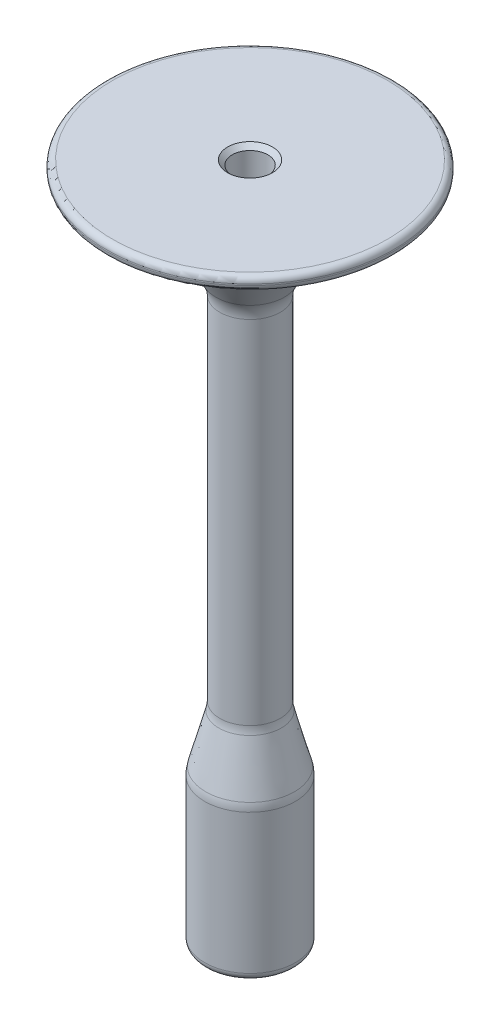
ISO-10303-21;
HEADER;
FILE_DESCRIPTION(('STEP AP214'),'2;1');
FILE_NAME('part.step','',(''),(''),'','','');
FILE_SCHEMA(('AUTOMOTIVE_DESIGN { 1 0 10303 214 1 1 1 1 }'));
ENDSEC;
DATA;
#1=APPLICATION_CONTEXT('core data for automotive mechanical design processes');
#2=APPLICATION_PROTOCOL_DEFINITION('international standard','automotive_design',2000,#1);
#3=PRODUCT_CONTEXT('',#1,'mechanical');
#4=PRODUCT('Part','Part','',(#3));
#5=PRODUCT_RELATED_PRODUCT_CATEGORY('part','',(#4));
#6=PRODUCT_DEFINITION_FORMATION('','',#4);
#7=PRODUCT_DEFINITION_CONTEXT('part definition',#1,'design');
#8=PRODUCT_DEFINITION('design','',#6,#7);
#9=PRODUCT_DEFINITION_SHAPE('','',#8);
#10=(LENGTH_UNIT() NAMED_UNIT(*) SI_UNIT(.MILLI.,.METRE.));
#11=(NAMED_UNIT(*) PLANE_ANGLE_UNIT() SI_UNIT($,.RADIAN.));
#12=(NAMED_UNIT(*) SI_UNIT($,.STERADIAN.) SOLID_ANGLE_UNIT());
#13=UNCERTAINTY_MEASURE_WITH_UNIT(LENGTH_MEASURE(1.E-05),#10,'distance_accuracy_value','');
#14=(GEOMETRIC_REPRESENTATION_CONTEXT(3) GLOBAL_UNCERTAINTY_ASSIGNED_CONTEXT((#13)) GLOBAL_UNIT_ASSIGNED_CONTEXT((#10,
#11,#12)) REPRESENTATION_CONTEXT('',''));
#15=CARTESIAN_POINT('',(0.,0.,0.));
#16=DIRECTION('',(0.,0.,1.));
#17=DIRECTION('',(1.,0.,0.));
#18=AXIS2_PLACEMENT_3D('',#15,#16,#17);
#19=CARTESIAN_POINT('',(0.,109.204446453007,0.));
#20=DIRECTION('',(0.,1.,0.));
#21=DIRECTION('',(0.,0.,1.));
#22=AXIS2_PLACEMENT_3D('',#19,#20,#21);
#23=CONICAL_SURFACE('',#22,12.696662510913,0.523598775598293);
#24=CARTESIAN_POINT('',(0.,97.1908181024499,0.));
#25=DIRECTION('',(0.,1.,0.));
#26=DIRECTION('',(0.,0.,1.));
#27=AXIS2_PLACEMENT_3D('',#24,#25,#26);
#28=CIRCLE('',#27,5.76059094877502);
#29=CARTESIAN_POINT('',(0.,97.1908181024499,5.76059094877502));
#30=VERTEX_POINT('',#29);
#31=EDGE_CURVE('E40',#30,#30,#28,.T.);
#32=ORIENTED_EDGE('',*,*,#31,.T.);
#33=EDGE_LOOP('',(#32));
#34=FACE_BOUND('',#33,.T.);
#35=CARTESIAN_POINT('',(0.,107.382151557562,0.));
#36=DIRECTION('',(0.,1.,0.));
#37=DIRECTION('',(0.,0.,1.));
#38=AXIS2_PLACEMENT_3D('',#35,#36,#37);
#39=CIRCLE('',#38,11.6445600624854);
#40=CARTESIAN_POINT('',(0.,107.382151557562,11.6445600624854));
#41=VERTEX_POINT('',#40);
#42=EDGE_CURVE('E44',#41,#41,#39,.F.);
#43=ORIENTED_EDGE('',*,*,#42,.T.);
#44=EDGE_LOOP('',(#43));
#45=FACE_BOUND('',#44,.T.);
#46=ADVANCED_FACE('F33',(#34,#45),#23,.T.);
#47=CARTESIAN_POINT('',(0.,22.86,0.));
#48=DIRECTION('',(0.,-1.,0.));
#49=DIRECTION('',(0.,0.,-1.));
#50=AXIS2_PLACEMENT_3D('',#47,#48,#49);
#51=CYLINDRICAL_SURFACE('',#50,5.08);
#52=CARTESIAN_POINT('',(0.,35.5482037389691,0.));
#53=DIRECTION('',(0.,-1.,0.));
#54=DIRECTION('',(0.,0.,-1.));
#55=AXIS2_PLACEMENT_3D('',#52,#53,#54);
#56=CIRCLE('',#55,5.08);
#57=CARTESIAN_POINT('',(0.,35.5482037389691,-5.08));
#58=VERTEX_POINT('',#57);
#59=EDGE_CURVE('E48',#58,#58,#56,.F.);
#60=ORIENTED_EDGE('',*,*,#59,.T.);
#61=EDGE_LOOP('',(#60));
#62=FACE_BOUND('',#61,.T.);
#63=CARTESIAN_POINT('',(0.,94.6508181024499,0.));
#64=DIRECTION('',(0.,-1.,0.));
#65=DIRECTION('',(0.,0.,-1.));
#66=AXIS2_PLACEMENT_3D('',#63,#64,#65);
#67=CIRCLE('',#66,5.08);
#68=CARTESIAN_POINT('',(0.,94.6508181024499,-5.08));
#69=VERTEX_POINT('',#68);
#70=EDGE_CURVE('E53',#69,#69,#67,.T.);
#71=ORIENTED_EDGE('',*,*,#70,.T.);
#72=EDGE_LOOP('',(#71));
#73=FACE_BOUND('',#72,.T.);
#74=ADVANCED_FACE('F116',(#62,#73),#51,.T.);
#75=CARTESIAN_POINT('',(0.,34.8794090512251,0.));
#76=DIRECTION('',(0.,-1.,0.));
#77=DIRECTION('',(0.,0.,-1.));
#78=AXIS2_PLACEMENT_3D('',#75,#76,#77);
#79=CONICAL_SURFACE('',#78,5.07999999999999,0.261799387799146);
#80=CARTESIAN_POINT('',(0.,26.0460060613768,0.));
#81=DIRECTION('',(0.,1.,0.));
#82=DIRECTION('',(0.,0.,1.));
#83=AXIS2_PLACEMENT_3D('',#80,#81,#82);
#84=CIRCLE('',#83,7.44690319754847);
#85=CARTESIAN_POINT('',(0.,26.0460060613768,7.44690319754847));
#86=VERTEX_POINT('',#85);
#87=EDGE_CURVE('E56',#86,#86,#84,.T.);
#88=ORIENTED_EDGE('',*,*,#87,.T.);
#89=EDGE_LOOP('',(#88));
#90=FACE_BOUND('',#89,.T.);
#91=CARTESIAN_POINT('',(0.,34.2334029898483,0.));
#92=DIRECTION('',(0.,-1.,0.));
#93=DIRECTION('',(0.,0.,-1.));
#94=AXIS2_PLACEMENT_3D('',#91,#92,#93);
#95=CIRCLE('',#94,5.25309680245152);
#96=CARTESIAN_POINT('',(0.,34.2334029898483,-5.25309680245152));
#97=VERTEX_POINT('',#96);
#98=EDGE_CURVE('E59',#97,#97,#95,.T.);
#99=ORIENTED_EDGE('',*,*,#98,.T.);
#100=EDGE_LOOP('',(#99));
#101=FACE_BOUND('',#100,.T.);
#102=ADVANCED_FACE('F121',(#90,#101),#79,.T.);
#103=CARTESIAN_POINT('',(0.,22.86,0.));
#104=DIRECTION('',(0.,-1.,0.));
#105=DIRECTION('',(0.,0.,-1.));
#106=AXIS2_PLACEMENT_3D('',#103,#104,#105);
#107=CYLINDRICAL_SURFACE('',#106,7.62);
#108=CARTESIAN_POINT('',(0.,24.731205312256,0.));
#109=DIRECTION('',(0.,1.,0.));
#110=DIRECTION('',(0.,0.,1.));
#111=AXIS2_PLACEMENT_3D('',#108,#109,#110);
#112=CIRCLE('',#111,7.62);
#113=CARTESIAN_POINT('',(0.,24.731205312256,7.62));
#114=VERTEX_POINT('',#113);
#115=EDGE_CURVE('E62',#114,#114,#112,.F.);
#116=ORIENTED_EDGE('',*,*,#115,.T.);
#117=EDGE_LOOP('',(#116));
#118=FACE_BOUND('',#117,.T.);
#119=CARTESIAN_POINT('',(0.,1.27,0.));
#120=DIRECTION('',(0.,1.,0.));
#121=DIRECTION('',(0.,0.,1.));
#122=AXIS2_PLACEMENT_3D('',#119,#120,#121);
#123=CIRCLE('',#122,7.62);
#124=CARTESIAN_POINT('',(0.,1.27,7.62));
#125=VERTEX_POINT('',#124);
#126=EDGE_CURVE('E84',#125,#125,#123,.T.);
#127=ORIENTED_EDGE('',*,*,#126,.T.);
#128=EDGE_LOOP('',(#127));
#129=FACE_BOUND('',#128,.T.);
#130=ADVANCED_FACE('F206',(#118,#129),#107,.T.);
#131=CARTESIAN_POINT('',(0.,22.86,0.));
#132=DIRECTION('',(0.,-1.,0.));
#133=DIRECTION('',(0.,0.,-1.));
#134=AXIS2_PLACEMENT_3D('',#131,#132,#133);
#135=CYLINDRICAL_SURFACE('',#134,5.08);
#136=CARTESIAN_POINT('',(0.,1.27,0.));
#137=DIRECTION('',(0.,1.,0.));
#138=DIRECTION('',(0.,0.,1.));
#139=AXIS2_PLACEMENT_3D('',#136,#137,#138);
#140=CIRCLE('',#139,5.08);
#141=CARTESIAN_POINT('',(0.,1.27,5.08));
#142=VERTEX_POINT('',#141);
#143=EDGE_CURVE('E77',#142,#142,#140,.F.);
#144=ORIENTED_EDGE('',*,*,#143,.T.);
#145=EDGE_LOOP('',(#144));
#146=FACE_BOUND('',#145,.T.);
#147=CARTESIAN_POINT('',(0.,22.86,0.));
#148=DIRECTION('',(0.,-1.,0.));
#149=DIRECTION('',(0.,0.,-1.));
#150=AXIS2_PLACEMENT_3D('',#147,#148,#149);
#151=CIRCLE('',#150,5.08);
#152=CARTESIAN_POINT('',(0.,22.86,-5.08));
#153=VERTEX_POINT('',#152);
#154=EDGE_CURVE('E93',#153,#153,#151,.T.);
#155=ORIENTED_EDGE('',*,*,#154,.F.);
#156=EDGE_LOOP('',(#155));
#157=FACE_BOUND('',#156,.T.);
#158=ADVANCED_FACE('F112',(#146,#157),#135,.F.);
#159=CARTESIAN_POINT('',(-5.08,22.86,0.));
#160=DIRECTION('',(0.,1.,0.));
#161=DIRECTION('',(0.,0.,1.));
#162=AXIS2_PLACEMENT_3D('',#159,#160,#161);
#163=PLANE('',#162);
#164=ORIENTED_EDGE('',*,*,#154,.T.);
#165=EDGE_LOOP('',(#164));
#166=FACE_BOUND('',#165,.T.);
#167=ADVANCED_FACE('F103',(#166),#163,.F.);
#168=CARTESIAN_POINT('',(0.,105.3,0.));
#169=DIRECTION('',(0.,-1.,0.));
#170=DIRECTION('',(0.,0.,-1.));
#171=AXIS2_PLACEMENT_3D('',#168,#169,#170);
#172=PLANE('',#171);
#173=CARTESIAN_POINT('',(0.,105.3,0.));
#174=DIRECTION('',(0.,-1.,0.));
#175=DIRECTION('',(0.,0.,-1.));
#176=AXIS2_PLACEMENT_3D('',#173,#174,#175);
#177=CIRCLE('',#176,3.);
#178=CARTESIAN_POINT('',(0.,105.3,-3.));
#179=VERTEX_POINT('',#178);
#180=EDGE_CURVE('E81',#179,#179,#177,.T.);
#181=ORIENTED_EDGE('',*,*,#180,.F.);
#182=EDGE_LOOP('',(#181));
#183=FACE_BOUND('',#182,.T.);
#184=ADVANCED_FACE('F101',(#183),#172,.F.);
#185=CARTESIAN_POINT('',(0.,22.86,0.));
#186=DIRECTION('',(0.,-1.,0.));
#187=DIRECTION('',(0.,0.,-1.));
#188=AXIS2_PLACEMENT_3D('',#185,#186,#187);
#189=CYLINDRICAL_SURFACE('',#188,3.);
#190=CARTESIAN_POINT('',(0.,113.538,0.));
#191=DIRECTION('',(0.,-1.,0.));
#192=DIRECTION('',(0.,0.,-1.));
#193=AXIS2_PLACEMENT_3D('',#190,#191,#192);
#194=CIRCLE('',#193,3.);
#195=CARTESIAN_POINT('',(0.,113.538,-3.));
#196=VERTEX_POINT('',#195);
#197=EDGE_CURVE('E87',#196,#196,#194,.F.);
#198=ORIENTED_EDGE('',*,*,#197,.T.);
#199=EDGE_LOOP('',(#198));
#200=FACE_BOUND('',#199,.T.);
#201=ORIENTED_EDGE('',*,*,#180,.T.);
#202=EDGE_LOOP('',(#201));
#203=FACE_BOUND('',#202,.T.);
#204=ADVANCED_FACE('F99',(#200,#203),#189,.F.);
#205=CARTESIAN_POINT('',(-3.,114.3,0.));
#206=DIRECTION('',(0.,-1.,0.));
#207=DIRECTION('',(0.,0.,-1.));
#208=AXIS2_PLACEMENT_3D('',#205,#206,#207);
#209=PLANE('',#208);
#210=CARTESIAN_POINT('',(0.,114.3,0.));
#211=DIRECTION('',(0.,-1.,0.));
#212=DIRECTION('',(0.,0.,-1.));
#213=AXIS2_PLACEMENT_3D('',#210,#211,#212);
#214=CIRCLE('',#213,23.114);
#215=CARTESIAN_POINT('',(0.,114.3,-23.114));
#216=VERTEX_POINT('',#215);
#217=EDGE_CURVE('E68',#216,#216,#214,.F.);
#218=ORIENTED_EDGE('',*,*,#217,.T.);
#219=EDGE_LOOP('',(#218));
#220=FACE_BOUND('',#219,.T.);
#221=CARTESIAN_POINT('',(0.,114.3,0.));
#222=DIRECTION('',(0.,-1.,0.));
#223=DIRECTION('',(0.,0.,-1.));
#224=AXIS2_PLACEMENT_3D('',#221,#222,#223);
#225=CIRCLE('',#224,3.762);
#226=CARTESIAN_POINT('',(0.,114.3,-3.762));
#227=VERTEX_POINT('',#226);
#228=EDGE_CURVE('E90',#227,#227,#225,.T.);
#229=ORIENTED_EDGE('',*,*,#228,.T.);
#230=EDGE_LOOP('',(#229));
#231=FACE_BOUND('',#230,.T.);
#232=ADVANCED_FACE('F109',(#220,#231),#209,.F.);
#233=CARTESIAN_POINT('',(0.,22.86,0.));
#234=DIRECTION('',(0.,-1.,0.));
#235=DIRECTION('',(0.,0.,-1.));
#236=AXIS2_PLACEMENT_3D('',#233,#234,#235);
#237=CYLINDRICAL_SURFACE('',#236,24.13);
#238=CARTESIAN_POINT('',(0.,113.284,0.));
#239=DIRECTION('',(0.,-1.,0.));
#240=DIRECTION('',(0.,0.,-1.));
#241=AXIS2_PLACEMENT_3D('',#238,#239,#240);
#242=CIRCLE('',#241,24.13);
#243=CARTESIAN_POINT('',(0.,113.284,-24.13));
#244=VERTEX_POINT('',#243);
#245=EDGE_CURVE('E71',#244,#244,#242,.T.);
#246=ORIENTED_EDGE('',*,*,#245,.T.);
#247=EDGE_LOOP('',(#246));
#248=FACE_BOUND('',#247,.T.);
#249=CARTESIAN_POINT('',(0.,113.047604219787,0.));
#250=DIRECTION('',(0.,1.,0.));
#251=DIRECTION('',(0.,0.,1.));
#252=AXIS2_PLACEMENT_3D('',#249,#250,#251);
#253=CIRCLE('',#252,24.13);
#254=CARTESIAN_POINT('',(0.,113.047604219787,24.13));
#255=VERTEX_POINT('',#254);
#256=EDGE_CURVE('E74',#255,#255,#253,.T.);
#257=ORIENTED_EDGE('',*,*,#256,.T.);
#258=EDGE_LOOP('',(#257));
#259=FACE_BOUND('',#258,.T.);
#260=ADVANCED_FACE('F198',(#248,#259),#237,.T.);
#261=CARTESIAN_POINT('',(0.,112.268,0.));
#262=DIRECTION('',(0.,1.,0.));
#263=DIRECTION('',(0.,0.,1.));
#264=AXIS2_PLACEMENT_3D('',#261,#262,#263);
#265=CONICAL_SURFACE('',#264,24.13,1.30899693899575);
#266=CARTESIAN_POINT('',(0.,109.749054755111,0.));
#267=DIRECTION('',(0.,1.,0.));
#268=DIRECTION('',(0.,0.,1.));
#269=AXIS2_PLACEMENT_3D('',#266,#267,#268);
#270=CIRCLE('',#269,14.7291683645896);
#271=CARTESIAN_POINT('',(0.,109.749054755111,14.7291683645896));
#272=VERTEX_POINT('',#271);
#273=EDGE_CURVE('E10',#272,#272,#270,.T.);
#274=ORIENTED_EDGE('',*,*,#273,.T.);
#275=EDGE_LOOP('',(#274));
#276=FACE_BOUND('',#275,.T.);
#277=CARTESIAN_POINT('',(0.,112.066223580277,0.));
#278=DIRECTION('',(0.,-1.,0.));
#279=DIRECTION('',(0.,0.,-1.));
#280=AXIS2_PLACEMENT_3D('',#277,#278,#279);
#281=CIRCLE('',#280,23.3769601498242);
#282=CARTESIAN_POINT('',(0.,112.066223580277,-23.3769601498242));
#283=VERTEX_POINT('',#282);
#284=EDGE_CURVE('E65',#283,#283,#281,.T.);
#285=ORIENTED_EDGE('',*,*,#284,.T.);
#286=EDGE_LOOP('',(#285));
#287=FACE_BOUND('',#286,.T.);
#288=ADVANCED_FACE('F134',(#276,#287),#265,.T.);
#289=CARTESIAN_POINT('',(0.,114.3,0.));
#290=DIRECTION('',(0.,1.,0.));
#291=DIRECTION('',(0.,0.,1.));
#292=AXIS2_PLACEMENT_3D('',#289,#290,#291);
#293=CONICAL_SURFACE('',#292,3.762,0.785398163397459);
#294=ORIENTED_EDGE('',*,*,#197,.F.);
#295=EDGE_LOOP('',(#294));
#296=FACE_BOUND('',#295,.T.);
#297=ORIENTED_EDGE('',*,*,#228,.F.);
#298=EDGE_LOOP('',(#297));
#299=FACE_BOUND('',#298,.T.);
#300=ADVANCED_FACE('F128',(#296,#299),#293,.F.);
#301=CARTESIAN_POINT('',(0.,1.27,0.));
#302=DIRECTION('',(0.,1.,0.));
#303=DIRECTION('',(0.,0.,1.));
#304=AXIS2_PLACEMENT_3D('',#301,#302,#303);
#305=TOROIDAL_SURFACE('',#304,6.35,1.27);
#306=ORIENTED_EDGE('',*,*,#143,.F.);
#307=EDGE_LOOP('',(#306));
#308=FACE_BOUND('',#307,.T.);
#309=CARTESIAN_POINT('',(0.,0.,0.));
#310=DIRECTION('',(0.,1.,0.));
#311=DIRECTION('',(0.,0.,1.));
#312=AXIS2_PLACEMENT_3D('',#309,#310,#311);
#313=CIRCLE('',#312,6.35);
#314=CARTESIAN_POINT('',(0.,0.,6.35));
#315=VERTEX_POINT('',#314);
#316=EDGE_CURVE('E78',#315,#315,#313,.T.);
#317=ORIENTED_EDGE('',*,*,#316,.F.);
#318=EDGE_LOOP('',(#317));
#319=FACE_BOUND('',#318,.T.);
#320=ADVANCED_FACE('F133',(#308,#319),#305,.T.);
#321=CARTESIAN_POINT('',(0.,1.27,0.));
#322=DIRECTION('',(0.,1.,0.));
#323=DIRECTION('',(0.,0.,1.));
#324=AXIS2_PLACEMENT_3D('',#321,#322,#323);
#325=TOROIDAL_SURFACE('',#324,6.35,1.27);
#326=ORIENTED_EDGE('',*,*,#126,.F.);
#327=EDGE_LOOP('',(#326));
#328=FACE_BOUND('',#327,.T.);
#329=ORIENTED_EDGE('',*,*,#316,.T.);
#330=EDGE_LOOP('',(#329));
#331=FACE_BOUND('',#330,.T.);
#332=ADVANCED_FACE('F136',(#328,#331),#325,.T.);
#333=CARTESIAN_POINT('',(0.,113.284,0.));
#334=DIRECTION('',(0.,-1.,0.));
#335=DIRECTION('',(0.,0.,-1.));
#336=AXIS2_PLACEMENT_3D('',#333,#334,#335);
#337=TOROIDAL_SURFACE('',#336,23.114,1.016);
#338=ORIENTED_EDGE('',*,*,#217,.F.);
#339=EDGE_LOOP('',(#338));
#340=FACE_BOUND('',#339,.T.);
#341=ORIENTED_EDGE('',*,*,#245,.F.);
#342=EDGE_LOOP('',(#341));
#343=FACE_BOUND('',#342,.T.);
#344=ADVANCED_FACE('F139',(#340,#343),#337,.T.);
#345=CARTESIAN_POINT('',(0.,113.047604219787,0.));
#346=DIRECTION('',(0.,1.,0.));
#347=DIRECTION('',(0.,0.,1.));
#348=AXIS2_PLACEMENT_3D('',#345,#346,#347);
#349=TOROIDAL_SURFACE('',#348,23.114,1.016);
#350=ORIENTED_EDGE('',*,*,#256,.F.);
#351=EDGE_LOOP('',(#350));
#352=FACE_BOUND('',#351,.T.);
#353=ORIENTED_EDGE('',*,*,#284,.F.);
#354=EDGE_LOOP('',(#353));
#355=FACE_BOUND('',#354,.T.);
#356=ADVANCED_FACE('F146',(#352,#355),#349,.T.);
#357=CARTESIAN_POINT('',(0.,24.731205312256,0.));
#358=DIRECTION('',(0.,1.,0.));
#359=DIRECTION('',(0.,0.,1.));
#360=AXIS2_PLACEMENT_3D('',#357,#358,#359);
#361=DEGENERATE_TOROIDAL_SURFACE('',#360,2.54,5.08,.T.);
#362=ORIENTED_EDGE('',*,*,#87,.F.);
#363=EDGE_LOOP('',(#362));
#364=FACE_BOUND('',#363,.T.);
#365=ORIENTED_EDGE('',*,*,#115,.F.);
#366=EDGE_LOOP('',(#365));
#367=FACE_BOUND('',#366,.T.);
#368=ADVANCED_FACE('F150',(#364,#367),#361,.T.);
#369=CARTESIAN_POINT('',(0.,35.5482037389691,0.));
#370=DIRECTION('',(0.,-1.,0.));
#371=DIRECTION('',(0.,0.,-1.));
#372=AXIS2_PLACEMENT_3D('',#369,#370,#371);
#373=TOROIDAL_SURFACE('',#372,10.16,5.08);
#374=ORIENTED_EDGE('',*,*,#59,.F.);
#375=EDGE_LOOP('',(#374));
#376=FACE_BOUND('',#375,.T.);
#377=ORIENTED_EDGE('',*,*,#98,.F.);
#378=EDGE_LOOP('',(#377));
#379=FACE_BOUND('',#378,.T.);
#380=ADVANCED_FACE('F154',(#376,#379),#373,.F.);
#381=CARTESIAN_POINT('',(0.,94.6508181024499,0.));
#382=DIRECTION('',(0.,-1.,0.));
#383=DIRECTION('',(0.,0.,-1.));
#384=AXIS2_PLACEMENT_3D('',#381,#382,#383);
#385=TOROIDAL_SURFACE('',#384,10.16,5.08);
#386=ORIENTED_EDGE('',*,*,#31,.F.);
#387=EDGE_LOOP('',(#386));
#388=FACE_BOUND('',#387,.T.);
#389=ORIENTED_EDGE('',*,*,#70,.F.);
#390=EDGE_LOOP('',(#389));
#391=FACE_BOUND('',#390,.T.);
#392=ADVANCED_FACE('F157',(#388,#391),#385,.F.);
#393=CARTESIAN_POINT('',(0.,104.842151557562,0.));
#394=DIRECTION('',(0.,-1.,0.));
#395=DIRECTION('',(0.,0.,-1.));
#396=AXIS2_PLACEMENT_3D('',#393,#394,#395);
#397=TOROIDAL_SURFACE('',#396,16.0439691137103,5.08);
#398=ORIENTED_EDGE('',*,*,#273,.F.);
#399=EDGE_LOOP('',(#398));
#400=FACE_BOUND('',#399,.T.);
#401=ORIENTED_EDGE('',*,*,#42,.F.);
#402=EDGE_LOOP('',(#401));
#403=FACE_BOUND('',#402,.T.);
#404=ADVANCED_FACE('F35',(#400,#403),#397,.F.);
#405=CLOSED_SHELL('',(#46,#74,#102,#130,#158,#167,#184,#204,#232,#260,#288,#300,#320,#332,#344,
#356,#368,#380,#392,#404));
#406=MANIFOLD_SOLID_BREP('B2',#405);
#407=ADVANCED_BREP_SHAPE_REPRESENTATION('',(#18,#406),#14);
#408=SHAPE_DEFINITION_REPRESENTATION(#9,#407);
ENDSEC;
END-ISO-10303-21;
